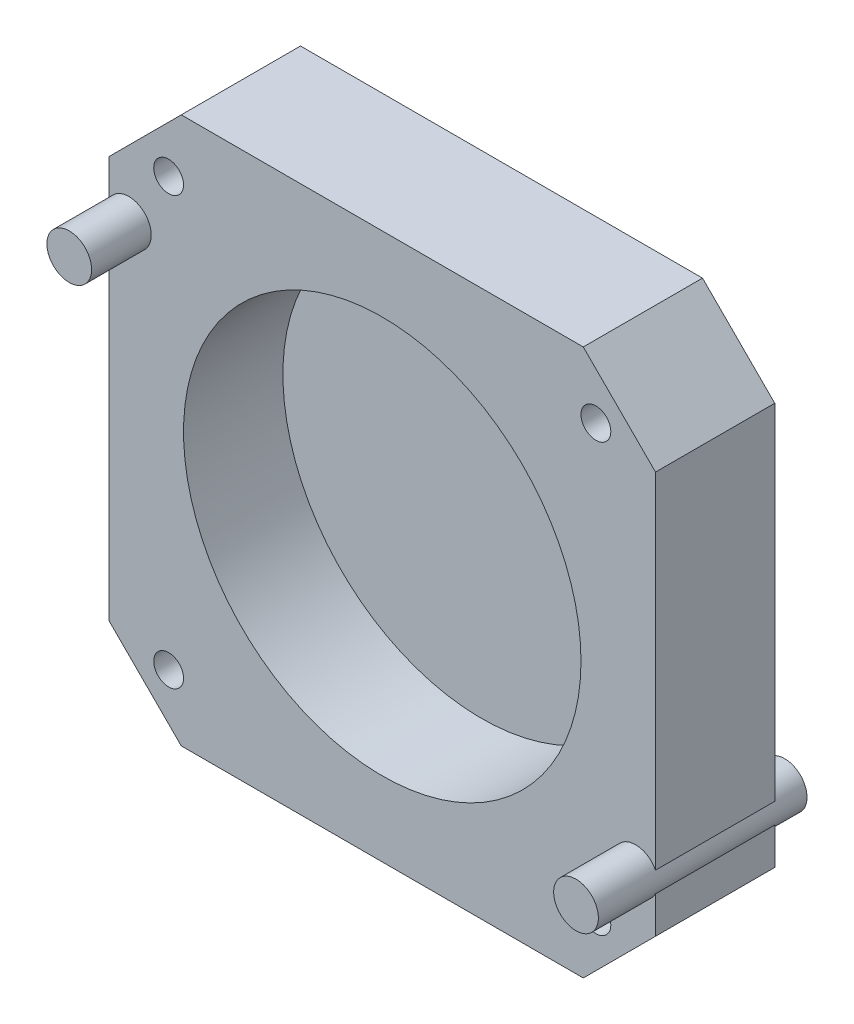
ISO-10303-21;
HEADER;
FILE_DESCRIPTION(('STEP AP214'),'2;1');
FILE_NAME('part.step','',(''),(''),'','','');
FILE_SCHEMA(('AUTOMOTIVE_DESIGN { 1 0 10303 214 1 1 1 1 }'));
ENDSEC;
DATA;
#1=APPLICATION_CONTEXT('core data for automotive mechanical design processes');
#2=APPLICATION_PROTOCOL_DEFINITION('international standard','automotive_design',2000,#1);
#3=PRODUCT_CONTEXT('',#1,'mechanical');
#4=PRODUCT('Part','Part','',(#3));
#5=PRODUCT_RELATED_PRODUCT_CATEGORY('part','',(#4));
#6=PRODUCT_DEFINITION_FORMATION('','',#4);
#7=PRODUCT_DEFINITION_CONTEXT('part definition',#1,'design');
#8=PRODUCT_DEFINITION('design','',#6,#7);
#9=PRODUCT_DEFINITION_SHAPE('','',#8);
#10=(LENGTH_UNIT() NAMED_UNIT(*) SI_UNIT(.MILLI.,.METRE.));
#11=(NAMED_UNIT(*) PLANE_ANGLE_UNIT() SI_UNIT($,.RADIAN.));
#12=(NAMED_UNIT(*) SI_UNIT($,.STERADIAN.) SOLID_ANGLE_UNIT());
#13=UNCERTAINTY_MEASURE_WITH_UNIT(LENGTH_MEASURE(1.E-05),#10,'distance_accuracy_value','');
#14=(GEOMETRIC_REPRESENTATION_CONTEXT(3) GLOBAL_UNCERTAINTY_ASSIGNED_CONTEXT((#13)) GLOBAL_UNIT_ASSIGNED_CONTEXT((#10,
#11,#12)) REPRESENTATION_CONTEXT('',''));
#15=CARTESIAN_POINT('',(0.,0.,0.));
#16=DIRECTION('',(0.,0.,1.));
#17=DIRECTION('',(1.,0.,0.));
#18=AXIS2_PLACEMENT_3D('',#15,#16,#17);
#19=CARTESIAN_POINT('',(0.,0.,0.));
#20=DIRECTION('',(0.,0.,1.));
#21=DIRECTION('',(1.,0.,0.));
#22=AXIS2_PLACEMENT_3D('',#19,#20,#21);
#23=PLANE('',#22);
#24=CARTESIAN_POINT('',(-21.5,21.5,0.));
#25=DIRECTION('',(0.,0.,1.));
#26=DIRECTION('',(1.,0.,0.));
#27=AXIS2_PLACEMENT_3D('',#24,#25,#26);
#28=CIRCLE('',#27,1.5);
#29=CARTESIAN_POINT('',(-20.,21.5,0.));
#30=VERTEX_POINT('',#29);
#31=EDGE_CURVE('E360',#30,#30,#28,.F.);
#32=ORIENTED_EDGE('',*,*,#31,.F.);
#33=EDGE_LOOP('',(#32));
#34=FACE_BOUND('',#33,.T.);
#35=CARTESIAN_POINT('',(-21.5,-21.5,0.));
#36=DIRECTION('',(0.,0.,1.));
#37=DIRECTION('',(1.,0.,0.));
#38=AXIS2_PLACEMENT_3D('',#35,#36,#37);
#39=CIRCLE('',#38,1.5);
#40=CARTESIAN_POINT('',(-20.,-21.5,0.));
#41=VERTEX_POINT('',#40);
#42=EDGE_CURVE('E374',#41,#41,#39,.F.);
#43=ORIENTED_EDGE('',*,*,#42,.F.);
#44=EDGE_LOOP('',(#43));
#45=FACE_BOUND('',#44,.T.);
#46=CARTESIAN_POINT('',(21.5,-21.5,0.));
#47=DIRECTION('',(0.,0.,1.));
#48=DIRECTION('',(1.,0.,0.));
#49=AXIS2_PLACEMENT_3D('',#46,#47,#48);
#50=CIRCLE('',#49,1.5);
#51=CARTESIAN_POINT('',(23.,-21.5,0.));
#52=VERTEX_POINT('',#51);
#53=EDGE_CURVE('E364',#52,#52,#50,.F.);
#54=ORIENTED_EDGE('',*,*,#53,.F.);
#55=EDGE_LOOP('',(#54));
#56=FACE_BOUND('',#55,.T.);
#57=CARTESIAN_POINT('',(21.5,21.5,0.));
#58=DIRECTION('',(0.,0.,1.));
#59=DIRECTION('',(1.,0.,0.));
#60=AXIS2_PLACEMENT_3D('',#57,#58,#59);
#61=CIRCLE('',#60,1.5);
#62=CARTESIAN_POINT('',(23.,21.5,0.));
#63=VERTEX_POINT('',#62);
#64=EDGE_CURVE('E391',#63,#63,#61,.F.);
#65=ORIENTED_EDGE('',*,*,#64,.F.);
#66=EDGE_LOOP('',(#65));
#67=FACE_BOUND('',#66,.T.);
#68=DIRECTION('',(0.,1.,0.));
#69=VECTOR('',#68,1.);
#70=CARTESIAN_POINT('',(27.5,27.5,0.));
#71=LINE('',#70,#69);
#72=CARTESIAN_POINT('',(27.5,-14.4692235935959,0.));
#73=VERTEX_POINT('',#72);
#74=CARTESIAN_POINT('',(27.5,20.2297077300919,0.));
#75=VERTEX_POINT('',#74);
#76=EDGE_CURVE('E395',#73,#75,#71,.T.);
#77=ORIENTED_EDGE('',*,*,#76,.F.);
#78=CARTESIAN_POINT('',(25.4999999999999,-15.5000000000002,0.));
#79=DIRECTION('',(0.,0.,1.));
#80=DIRECTION('',(1.,0.,0.));
#81=AXIS2_PLACEMENT_3D('',#78,#79,#80);
#82=CIRCLE('',#81,2.25);
#83=CARTESIAN_POINT('',(27.5,-16.5307764064045,0.));
#84=VERTEX_POINT('',#83);
#85=EDGE_CURVE('E234',#73,#84,#82,.T.);
#86=ORIENTED_EDGE('',*,*,#85,.T.);
#87=CARTESIAN_POINT('',(27.5,-20.2297077300919,0.));
#88=VERTEX_POINT('',#87);
#89=EDGE_CURVE('E415',#88,#84,#71,.T.);
#90=ORIENTED_EDGE('',*,*,#89,.F.);
#91=DIRECTION('',(0.707106781186547,0.707106781186548,0.));
#92=VECTOR('',#91,1.);
#93=CARTESIAN_POINT('',(20.229707730092,-27.5,0.));
#94=LINE('',#93,#92);
#95=CARTESIAN_POINT('',(20.229707730092,-27.5,0.));
#96=VERTEX_POINT('',#95);
#97=EDGE_CURVE('E306',#96,#88,#94,.T.);
#98=ORIENTED_EDGE('',*,*,#97,.F.);
#99=DIRECTION('',(1.,0.,0.));
#100=VECTOR('',#99,1.);
#101=CARTESIAN_POINT('',(-27.5,-27.5,0.));
#102=LINE('',#101,#100);
#103=CARTESIAN_POINT('',(-20.2297077300919,-27.5,0.));
#104=VERTEX_POINT('',#103);
#105=EDGE_CURVE('E428',#104,#96,#102,.T.);
#106=ORIENTED_EDGE('',*,*,#105,.F.);
#107=DIRECTION('',(0.707106781186548,-0.707106781186548,0.));
#108=VECTOR('',#107,1.);
#109=CARTESIAN_POINT('',(-27.5,-20.2297077300919,0.));
#110=LINE('',#109,#108);
#111=CARTESIAN_POINT('',(-27.5,-20.2297077300919,0.));
#112=VERTEX_POINT('',#111);
#113=EDGE_CURVE('E326',#112,#104,#110,.T.);
#114=ORIENTED_EDGE('',*,*,#113,.F.);
#115=DIRECTION('',(0.,-1.,0.));
#116=VECTOR('',#115,1.);
#117=CARTESIAN_POINT('',(-27.5,27.5,0.));
#118=LINE('',#117,#116);
#119=CARTESIAN_POINT('',(-27.5,14.4692235935956,0.));
#120=VERTEX_POINT('',#119);
#121=EDGE_CURVE('E423',#120,#112,#118,.T.);
#122=ORIENTED_EDGE('',*,*,#121,.F.);
#123=CARTESIAN_POINT('',(-25.5,15.5,0.));
#124=DIRECTION('',(0.,0.,1.));
#125=DIRECTION('',(1.,0.,0.));
#126=AXIS2_PLACEMENT_3D('',#123,#124,#125);
#127=CIRCLE('',#126,2.25);
#128=CARTESIAN_POINT('',(-27.5,16.5307764064044,0.));
#129=VERTEX_POINT('',#128);
#130=EDGE_CURVE('E414',#120,#129,#127,.T.);
#131=ORIENTED_EDGE('',*,*,#130,.T.);
#132=CARTESIAN_POINT('',(-27.5,20.2297077300919,0.));
#133=VERTEX_POINT('',#132);
#134=EDGE_CURVE('E424',#133,#129,#118,.T.);
#135=ORIENTED_EDGE('',*,*,#134,.F.);
#136=DIRECTION('',(-0.707106781186547,-0.707106781186548,0.));
#137=VECTOR('',#136,1.);
#138=CARTESIAN_POINT('',(-27.5,20.2297077300919,0.));
#139=LINE('',#138,#137);
#140=CARTESIAN_POINT('',(-20.229707730092,27.5,0.));
#141=VERTEX_POINT('',#140);
#142=EDGE_CURVE('E317',#141,#133,#139,.T.);
#143=ORIENTED_EDGE('',*,*,#142,.F.);
#144=DIRECTION('',(-1.,0.,0.));
#145=VECTOR('',#144,1.);
#146=CARTESIAN_POINT('',(-27.5,27.5,0.));
#147=LINE('',#146,#145);
#148=CARTESIAN_POINT('',(20.2297077300919,27.5,0.));
#149=VERTEX_POINT('',#148);
#150=EDGE_CURVE('E419',#149,#141,#147,.T.);
#151=ORIENTED_EDGE('',*,*,#150,.F.);
#152=DIRECTION('',(-0.707106781186548,0.707106781186548,0.));
#153=VECTOR('',#152,1.);
#154=CARTESIAN_POINT('',(20.2297077300919,27.5,0.));
#155=LINE('',#154,#153);
#156=EDGE_CURVE('E302',#75,#149,#155,.T.);
#157=ORIENTED_EDGE('',*,*,#156,.F.);
#158=EDGE_LOOP('',(#77,#86,#90,#98,#106,#114,#122,#131,#135,#143,#151,#157));
#159=FACE_BOUND('',#158,.T.);
#160=DIRECTION('',(0.,1.,0.));
#161=VECTOR('',#160,1.);
#162=CARTESIAN_POINT('',(-15.,15.,0.));
#163=LINE('',#162,#161);
#164=CARTESIAN_POINT('',(-15.,-15.,0.));
#165=VERTEX_POINT('',#164);
#166=CARTESIAN_POINT('',(-15.,15.,0.));
#167=VERTEX_POINT('',#166);
#168=EDGE_CURVE('E206',#165,#167,#163,.T.);
#169=ORIENTED_EDGE('',*,*,#168,.F.);
#170=DIRECTION('',(-1.,0.,0.));
#171=VECTOR('',#170,1.);
#172=CARTESIAN_POINT('',(15.,-15.,0.));
#173=LINE('',#172,#171);
#174=CARTESIAN_POINT('',(15.,-15.,0.));
#175=VERTEX_POINT('',#174);
#176=EDGE_CURVE('E203',#175,#165,#173,.T.);
#177=ORIENTED_EDGE('',*,*,#176,.F.);
#178=DIRECTION('',(0.,-1.,0.));
#179=VECTOR('',#178,1.);
#180=CARTESIAN_POINT('',(15.,15.,0.));
#181=LINE('',#180,#179);
#182=CARTESIAN_POINT('',(15.,15.,0.));
#183=VERTEX_POINT('',#182);
#184=EDGE_CURVE('E66',#183,#175,#181,.T.);
#185=ORIENTED_EDGE('',*,*,#184,.F.);
#186=DIRECTION('',(1.,0.,0.));
#187=VECTOR('',#186,1.);
#188=CARTESIAN_POINT('',(15.,15.,0.));
#189=LINE('',#188,#187);
#190=EDGE_CURVE('E61',#167,#183,#189,.T.);
#191=ORIENTED_EDGE('',*,*,#190,.F.);
#192=EDGE_LOOP('',(#169,#177,#185,#191));
#193=FACE_BOUND('',#192,.T.);
#194=ADVANCED_FACE('F45',(#34,#45,#56,#67,#159,#193),#23,.F.);
#195=CARTESIAN_POINT('',(27.5,27.5,12.));
#196=DIRECTION('',(-1.,0.,0.));
#197=DIRECTION('',(0.,0.,1.));
#198=AXIS2_PLACEMENT_3D('',#195,#196,#197);
#199=PLANE('',#198);
#200=ORIENTED_EDGE('',*,*,#89,.T.);
#201=DIRECTION('',(0.,0.,1.));
#202=VECTOR('',#201,1.);
#203=CARTESIAN_POINT('',(27.5,-16.5307764064045,-3.));
#204=LINE('',#203,#202);
#205=CARTESIAN_POINT('',(27.5,-16.5307764064045,12.));
#206=VERTEX_POINT('',#205);
#207=EDGE_CURVE('E275',#84,#206,#204,.T.);
#208=ORIENTED_EDGE('',*,*,#207,.T.);
#209=DIRECTION('',(0.,1.,0.));
#210=VECTOR('',#209,1.);
#211=CARTESIAN_POINT('',(27.5,27.5,12.));
#212=LINE('',#211,#210);
#213=CARTESIAN_POINT('',(27.5,-20.2297077300919,12.));
#214=VERTEX_POINT('',#213);
#215=EDGE_CURVE('E396',#214,#206,#212,.T.);
#216=ORIENTED_EDGE('',*,*,#215,.F.);
#217=DIRECTION('',(0.,0.,1.));
#218=VECTOR('',#217,1.);
#219=CARTESIAN_POINT('',(27.5,-20.2297077300919,-0.000999999999999265));
#220=LINE('',#219,#218);
#221=EDGE_CURVE('E318',#88,#214,#220,.T.);
#222=ORIENTED_EDGE('',*,*,#221,.F.);
#223=EDGE_LOOP('',(#200,#208,#216,#222));
#224=FACE_BOUND('',#223,.T.);
#225=ADVANCED_FACE('F444',(#224),#199,.F.);
#226=CARTESIAN_POINT('',(-27.5,27.5,12.));
#227=DIRECTION('',(1.,0.,0.));
#228=DIRECTION('',(0.,0.,-1.));
#229=AXIS2_PLACEMENT_3D('',#226,#227,#228);
#230=PLANE('',#229);
#231=ORIENTED_EDGE('',*,*,#134,.T.);
#232=DIRECTION('',(0.,0.,1.));
#233=VECTOR('',#232,1.);
#234=CARTESIAN_POINT('',(-27.5,16.5307764064044,-3.));
#235=LINE('',#234,#233);
#236=CARTESIAN_POINT('',(-27.5,16.5307764064044,12.));
#237=VERTEX_POINT('',#236);
#238=EDGE_CURVE('E294',#129,#237,#235,.T.);
#239=ORIENTED_EDGE('',*,*,#238,.T.);
#240=DIRECTION('',(0.,-1.,0.));
#241=VECTOR('',#240,1.);
#242=CARTESIAN_POINT('',(-27.5,27.5,12.));
#243=LINE('',#242,#241);
#244=CARTESIAN_POINT('',(-27.5,20.2297077300919,12.));
#245=VERTEX_POINT('',#244);
#246=EDGE_CURVE('E406',#245,#237,#243,.T.);
#247=ORIENTED_EDGE('',*,*,#246,.F.);
#248=DIRECTION('',(0.,0.,1.));
#249=VECTOR('',#248,1.);
#250=CARTESIAN_POINT('',(-27.5,20.2297077300919,-0.000999999999999265));
#251=LINE('',#250,#249);
#252=EDGE_CURVE('E348',#133,#245,#251,.T.);
#253=ORIENTED_EDGE('',*,*,#252,.F.);
#254=EDGE_LOOP('',(#231,#239,#247,#253));
#255=FACE_BOUND('',#254,.T.);
#256=ADVANCED_FACE('F491',(#255),#230,.F.);
#257=CARTESIAN_POINT('',(27.5,-14.4692235935959,12.));
#258=VERTEX_POINT('',#257);
#259=CARTESIAN_POINT('',(27.5,20.2297077300919,12.));
#260=VERTEX_POINT('',#259);
#261=EDGE_CURVE('E401',#258,#260,#212,.T.);
#262=ORIENTED_EDGE('',*,*,#261,.F.);
#263=DIRECTION('',(0.,0.,1.));
#264=VECTOR('',#263,1.);
#265=CARTESIAN_POINT('',(27.5,-14.4692235935959,-3.));
#266=LINE('',#265,#264);
#267=EDGE_CURVE('E271',#258,#73,#266,.F.);
#268=ORIENTED_EDGE('',*,*,#267,.T.);
#269=ORIENTED_EDGE('',*,*,#76,.T.);
#270=DIRECTION('',(0.,0.,1.));
#271=VECTOR('',#270,1.);
#272=CARTESIAN_POINT('',(27.5,20.2297077300919,-0.000999999999999265));
#273=LINE('',#272,#271);
#274=EDGE_CURVE('E305',#75,#260,#273,.T.);
#275=ORIENTED_EDGE('',*,*,#274,.T.);
#276=EDGE_LOOP('',(#262,#268,#269,#275));
#277=FACE_BOUND('',#276,.T.);
#278=ADVANCED_FACE('F47',(#277),#199,.F.);
#279=CARTESIAN_POINT('',(-27.5,27.5,12.));
#280=DIRECTION('',(0.,-1.,0.));
#281=DIRECTION('',(0.,0.,-1.));
#282=AXIS2_PLACEMENT_3D('',#279,#280,#281);
#283=PLANE('',#282);
#284=DIRECTION('',(-1.,0.,0.));
#285=VECTOR('',#284,1.);
#286=CARTESIAN_POINT('',(-27.5,27.5,12.));
#287=LINE('',#286,#285);
#288=CARTESIAN_POINT('',(20.2297077300919,27.5,12.));
#289=VERTEX_POINT('',#288);
#290=CARTESIAN_POINT('',(-20.229707730092,27.5,12.));
#291=VERTEX_POINT('',#290);
#292=EDGE_CURVE('E400',#289,#291,#287,.T.);
#293=ORIENTED_EDGE('',*,*,#292,.F.);
#294=DIRECTION('',(0.,0.,1.));
#295=VECTOR('',#294,1.);
#296=CARTESIAN_POINT('',(20.2297077300919,27.5,-0.000999999999999265));
#297=LINE('',#296,#295);
#298=EDGE_CURVE('E307',#149,#289,#297,.T.);
#299=ORIENTED_EDGE('',*,*,#298,.F.);
#300=ORIENTED_EDGE('',*,*,#150,.T.);
#301=DIRECTION('',(0.,0.,1.));
#302=VECTOR('',#301,1.);
#303=CARTESIAN_POINT('',(-20.229707730092,27.5,-0.000999999999999265));
#304=LINE('',#303,#302);
#305=EDGE_CURVE('E349',#141,#291,#304,.T.);
#306=ORIENTED_EDGE('',*,*,#305,.T.);
#307=EDGE_LOOP('',(#293,#299,#300,#306));
#308=FACE_BOUND('',#307,.T.);
#309=ADVANCED_FACE('F481',(#308),#283,.F.);
#310=CARTESIAN_POINT('',(-27.5,14.4692235935956,12.));
#311=VERTEX_POINT('',#310);
#312=CARTESIAN_POINT('',(-27.5,-20.2297077300919,12.));
#313=VERTEX_POINT('',#312);
#314=EDGE_CURVE('E405',#311,#313,#243,.T.);
#315=ORIENTED_EDGE('',*,*,#314,.F.);
#316=DIRECTION('',(0.,0.,1.));
#317=VECTOR('',#316,1.);
#318=CARTESIAN_POINT('',(-27.5,14.4692235935956,-3.));
#319=LINE('',#318,#317);
#320=EDGE_CURVE('E290',#311,#120,#319,.F.);
#321=ORIENTED_EDGE('',*,*,#320,.T.);
#322=ORIENTED_EDGE('',*,*,#121,.T.);
#323=DIRECTION('',(0.,0.,1.));
#324=VECTOR('',#323,1.);
#325=CARTESIAN_POINT('',(-27.5,-20.2297077300919,-0.000999999999999265));
#326=LINE('',#325,#324);
#327=EDGE_CURVE('E331',#112,#313,#326,.T.);
#328=ORIENTED_EDGE('',*,*,#327,.T.);
#329=EDGE_LOOP('',(#315,#321,#322,#328));
#330=FACE_BOUND('',#329,.T.);
#331=ADVANCED_FACE('F466',(#330),#230,.F.);
#332=CARTESIAN_POINT('',(-27.5,-27.5,12.));
#333=DIRECTION('',(0.,1.,0.));
#334=DIRECTION('',(0.,0.,1.));
#335=AXIS2_PLACEMENT_3D('',#332,#333,#334);
#336=PLANE('',#335);
#337=DIRECTION('',(1.,0.,0.));
#338=VECTOR('',#337,1.);
#339=CARTESIAN_POINT('',(-27.5,-27.5,12.));
#340=LINE('',#339,#338);
#341=CARTESIAN_POINT('',(-20.2297077300919,-27.5,12.));
#342=VERTEX_POINT('',#341);
#343=CARTESIAN_POINT('',(20.229707730092,-27.5,12.));
#344=VERTEX_POINT('',#343);
#345=EDGE_CURVE('E410',#342,#344,#340,.T.);
#346=ORIENTED_EDGE('',*,*,#345,.F.);
#347=DIRECTION('',(0.,0.,1.));
#348=VECTOR('',#347,1.);
#349=CARTESIAN_POINT('',(-20.2297077300919,-27.5,-0.000999999999999265));
#350=LINE('',#349,#348);
#351=EDGE_CURVE('E301',#104,#342,#350,.T.);
#352=ORIENTED_EDGE('',*,*,#351,.F.);
#353=ORIENTED_EDGE('',*,*,#105,.T.);
#354=DIRECTION('',(0.,0.,1.));
#355=VECTOR('',#354,1.);
#356=CARTESIAN_POINT('',(20.229707730092,-27.5,-0.000999999999999265));
#357=LINE('',#356,#355);
#358=EDGE_CURVE('E322',#96,#344,#357,.T.);
#359=ORIENTED_EDGE('',*,*,#358,.T.);
#360=EDGE_LOOP('',(#346,#352,#353,#359));
#361=FACE_BOUND('',#360,.T.);
#362=ADVANCED_FACE('F457',(#361),#336,.F.);
#363=CARTESIAN_POINT('',(0.,0.,12.));
#364=DIRECTION('',(0.,0.,1.));
#365=DIRECTION('',(1.,0.,0.));
#366=AXIS2_PLACEMENT_3D('',#363,#364,#365);
#367=PLANE('',#366);
#368=CARTESIAN_POINT('',(25.4999999999999,-15.5000000000002,12.));
#369=DIRECTION('',(0.,0.,1.));
#370=DIRECTION('',(1.,0.,0.));
#371=AXIS2_PLACEMENT_3D('',#368,#369,#370);
#372=CIRCLE('',#371,2.25);
#373=EDGE_CURVE('E279',#258,#206,#372,.T.);
#374=ORIENTED_EDGE('',*,*,#373,.F.);
#375=ORIENTED_EDGE('',*,*,#261,.T.);
#376=DIRECTION('',(0.707106781186548,-0.707106781186548,0.));
#377=VECTOR('',#376,1.);
#378=CARTESIAN_POINT('',(20.2297077300919,27.5,12.));
#379=LINE('',#378,#377);
#380=EDGE_CURVE('E310',#289,#260,#379,.T.);
#381=ORIENTED_EDGE('',*,*,#380,.F.);
#382=ORIENTED_EDGE('',*,*,#292,.T.);
#383=DIRECTION('',(0.707106781186547,0.707106781186548,0.));
#384=VECTOR('',#383,1.);
#385=CARTESIAN_POINT('',(-27.5,20.2297077300919,12.));
#386=LINE('',#385,#384);
#387=EDGE_CURVE('E345',#245,#291,#386,.T.);
#388=ORIENTED_EDGE('',*,*,#387,.F.);
#389=ORIENTED_EDGE('',*,*,#246,.T.);
#390=CARTESIAN_POINT('',(-25.5,15.5,12.));
#391=DIRECTION('',(0.,0.,1.));
#392=DIRECTION('',(1.,0.,0.));
#393=AXIS2_PLACEMENT_3D('',#390,#391,#392);
#394=CIRCLE('',#393,2.25);
#395=EDGE_CURVE('E298',#311,#237,#394,.T.);
#396=ORIENTED_EDGE('',*,*,#395,.F.);
#397=ORIENTED_EDGE('',*,*,#314,.T.);
#398=DIRECTION('',(-0.707106781186548,0.707106781186548,0.));
#399=VECTOR('',#398,1.);
#400=CARTESIAN_POINT('',(-27.5,-20.2297077300919,12.));
#401=LINE('',#400,#399);
#402=EDGE_CURVE('E335',#342,#313,#401,.T.);
#403=ORIENTED_EDGE('',*,*,#402,.F.);
#404=ORIENTED_EDGE('',*,*,#345,.T.);
#405=DIRECTION('',(-0.707106781186547,-0.707106781186548,0.));
#406=VECTOR('',#405,1.);
#407=CARTESIAN_POINT('',(20.229707730092,-27.5,12.));
#408=LINE('',#407,#406);
#409=EDGE_CURVE('E321',#214,#344,#408,.T.);
#410=ORIENTED_EDGE('',*,*,#409,.F.);
#411=ORIENTED_EDGE('',*,*,#215,.T.);
#412=EDGE_LOOP('',(#374,#375,#381,#382,#388,#389,#396,#397,#403,#404,#410,#411));
#413=FACE_BOUND('',#412,.T.);
#414=CARTESIAN_POINT('',(0.,0.,12.));
#415=DIRECTION('',(0.,0.,1.));
#416=DIRECTION('',(1.,0.,0.));
#417=AXIS2_PLACEMENT_3D('',#414,#415,#416);
#418=CIRCLE('',#417,20.);
#419=CARTESIAN_POINT('',(20.,0.,12.));
#420=VERTEX_POINT('',#419);
#421=EDGE_CURVE('E353',#420,#420,#418,.T.);
#422=ORIENTED_EDGE('',*,*,#421,.F.);
#423=EDGE_LOOP('',(#422));
#424=FACE_BOUND('',#423,.T.);
#425=CARTESIAN_POINT('',(-21.5,21.5,12.));
#426=DIRECTION('',(0.,0.,1.));
#427=DIRECTION('',(-1.,0.,0.));
#428=AXIS2_PLACEMENT_3D('',#425,#426,#427);
#429=CIRCLE('',#428,1.5);
#430=CARTESIAN_POINT('',(-23.,21.5,12.));
#431=VERTEX_POINT('',#430);
#432=EDGE_CURVE('E378',#431,#431,#429,.T.);
#433=ORIENTED_EDGE('',*,*,#432,.F.);
#434=EDGE_LOOP('',(#433));
#435=FACE_BOUND('',#434,.T.);
#436=CARTESIAN_POINT('',(-21.5,-21.5,12.));
#437=DIRECTION('',(0.,0.,1.));
#438=DIRECTION('',(1.,0.,0.));
#439=AXIS2_PLACEMENT_3D('',#436,#437,#438);
#440=CIRCLE('',#439,1.5);
#441=CARTESIAN_POINT('',(-20.,-21.5,12.));
#442=VERTEX_POINT('',#441);
#443=EDGE_CURVE('E369',#442,#442,#440,.T.);
#444=ORIENTED_EDGE('',*,*,#443,.F.);
#445=EDGE_LOOP('',(#444));
#446=FACE_BOUND('',#445,.T.);
#447=CARTESIAN_POINT('',(21.5,-21.5,12.));
#448=DIRECTION('',(0.,0.,1.));
#449=DIRECTION('',(-1.,0.,0.));
#450=AXIS2_PLACEMENT_3D('',#447,#448,#449);
#451=CIRCLE('',#450,1.5);
#452=CARTESIAN_POINT('',(20.,-21.5,12.));
#453=VERTEX_POINT('',#452);
#454=EDGE_CURVE('E368',#453,#453,#451,.T.);
#455=ORIENTED_EDGE('',*,*,#454,.F.);
#456=EDGE_LOOP('',(#455));
#457=FACE_BOUND('',#456,.T.);
#458=CARTESIAN_POINT('',(21.5,21.5,12.));
#459=DIRECTION('',(0.,0.,1.));
#460=DIRECTION('',(1.,0.,0.));
#461=AXIS2_PLACEMENT_3D('',#458,#459,#460);
#462=CIRCLE('',#461,1.5);
#463=CARTESIAN_POINT('',(23.,21.5,12.));
#464=VERTEX_POINT('',#463);
#465=EDGE_CURVE('E373',#464,#464,#462,.T.);
#466=ORIENTED_EDGE('',*,*,#465,.F.);
#467=EDGE_LOOP('',(#466));
#468=FACE_BOUND('',#467,.T.);
#469=ADVANCED_FACE('F451',(#413,#424,#435,#446,#457,#468),#367,.T.);
#470=CARTESIAN_POINT('',(21.5,21.5,-0.000999999999999265));
#471=DIRECTION('',(0.,0.,1.));
#472=DIRECTION('',(1.,0.,0.));
#473=AXIS2_PLACEMENT_3D('',#470,#471,#472);
#474=CYLINDRICAL_SURFACE('',#473,1.5);
#475=ORIENTED_EDGE('',*,*,#465,.T.);
#476=EDGE_LOOP('',(#475));
#477=FACE_BOUND('',#476,.T.);
#478=ORIENTED_EDGE('',*,*,#64,.T.);
#479=EDGE_LOOP('',(#478));
#480=FACE_BOUND('',#479,.T.);
#481=ADVANCED_FACE('F604',(#477,#480),#474,.F.);
#482=CARTESIAN_POINT('',(21.5,-21.5,-0.000999999999999265));
#483=DIRECTION('',(0.,0.,1.));
#484=DIRECTION('',(1.,0.,0.));
#485=AXIS2_PLACEMENT_3D('',#482,#483,#484);
#486=CYLINDRICAL_SURFACE('',#485,1.5);
#487=ORIENTED_EDGE('',*,*,#454,.T.);
#488=EDGE_LOOP('',(#487));
#489=FACE_BOUND('',#488,.T.);
#490=ORIENTED_EDGE('',*,*,#53,.T.);
#491=EDGE_LOOP('',(#490));
#492=FACE_BOUND('',#491,.T.);
#493=ADVANCED_FACE('F594',(#489,#492),#486,.F.);
#494=CARTESIAN_POINT('',(-21.5,-21.5,-0.000999999999999265));
#495=DIRECTION('',(0.,0.,1.));
#496=DIRECTION('',(1.,0.,0.));
#497=AXIS2_PLACEMENT_3D('',#494,#495,#496);
#498=CYLINDRICAL_SURFACE('',#497,1.5);
#499=ORIENTED_EDGE('',*,*,#443,.T.);
#500=EDGE_LOOP('',(#499));
#501=FACE_BOUND('',#500,.T.);
#502=ORIENTED_EDGE('',*,*,#42,.T.);
#503=EDGE_LOOP('',(#502));
#504=FACE_BOUND('',#503,.T.);
#505=ADVANCED_FACE('F584',(#501,#504),#498,.F.);
#506=CARTESIAN_POINT('',(-21.5,21.5,-0.000999999999999265));
#507=DIRECTION('',(0.,0.,1.));
#508=DIRECTION('',(1.,0.,0.));
#509=AXIS2_PLACEMENT_3D('',#506,#507,#508);
#510=CYLINDRICAL_SURFACE('',#509,1.5);
#511=ORIENTED_EDGE('',*,*,#432,.T.);
#512=EDGE_LOOP('',(#511));
#513=FACE_BOUND('',#512,.T.);
#514=ORIENTED_EDGE('',*,*,#31,.T.);
#515=EDGE_LOOP('',(#514));
#516=FACE_BOUND('',#515,.T.);
#517=ADVANCED_FACE('F574',(#513,#516),#510,.F.);
#518=CARTESIAN_POINT('',(0.,0.,2.));
#519=DIRECTION('',(0.,0.,1.));
#520=DIRECTION('',(1.,0.,0.));
#521=AXIS2_PLACEMENT_3D('',#518,#519,#520);
#522=CYLINDRICAL_SURFACE('',#521,20.);
#523=CARTESIAN_POINT('',(0.,0.,2.));
#524=DIRECTION('',(0.,0.,1.));
#525=DIRECTION('',(1.,0.,0.));
#526=AXIS2_PLACEMENT_3D('',#523,#524,#525);
#527=CIRCLE('',#526,20.);
#528=CARTESIAN_POINT('',(20.,0.,2.));
#529=VERTEX_POINT('',#528);
#530=EDGE_CURVE('E356',#529,#529,#527,.T.);
#531=ORIENTED_EDGE('',*,*,#530,.F.);
#532=EDGE_LOOP('',(#531));
#533=FACE_BOUND('',#532,.T.);
#534=ORIENTED_EDGE('',*,*,#421,.T.);
#535=EDGE_LOOP('',(#534));
#536=FACE_BOUND('',#535,.T.);
#537=ADVANCED_FACE('F504',(#533,#536),#522,.F.);
#538=CARTESIAN_POINT('',(0.,0.,2.));
#539=DIRECTION('',(0.,0.,1.));
#540=DIRECTION('',(1.,0.,0.));
#541=AXIS2_PLACEMENT_3D('',#538,#539,#540);
#542=PLANE('',#541);
#543=ORIENTED_EDGE('',*,*,#530,.T.);
#544=EDGE_LOOP('',(#543));
#545=FACE_BOUND('',#544,.T.);
#546=ADVANCED_FACE('F496',(#545),#542,.T.);
#547=CARTESIAN_POINT('',(-27.5,20.2297077300919,-0.000999999999999265));
#548=DIRECTION('',(0.707106781186548,-0.707106781186547,0.));
#549=DIRECTION('',(0.707106781186547,0.707106781186548,0.));
#550=AXIS2_PLACEMENT_3D('',#547,#548,#549);
#551=PLANE('',#550);
#552=ORIENTED_EDGE('',*,*,#142,.T.);
#553=ORIENTED_EDGE('',*,*,#252,.T.);
#554=ORIENTED_EDGE('',*,*,#387,.T.);
#555=ORIENTED_EDGE('',*,*,#305,.F.);
#556=EDGE_LOOP('',(#552,#553,#554,#555));
#557=FACE_BOUND('',#556,.T.);
#558=ADVANCED_FACE('F494',(#557),#551,.F.);
#559=CARTESIAN_POINT('',(20.2297077300919,27.5,-0.000999999999999265));
#560=DIRECTION('',(-0.707106781186548,-0.707106781186548,0.));
#561=DIRECTION('',(0.707106781186548,-0.707106781186548,0.));
#562=AXIS2_PLACEMENT_3D('',#559,#560,#561);
#563=PLANE('',#562);
#564=ORIENTED_EDGE('',*,*,#156,.T.);
#565=ORIENTED_EDGE('',*,*,#298,.T.);
#566=ORIENTED_EDGE('',*,*,#380,.T.);
#567=ORIENTED_EDGE('',*,*,#274,.F.);
#568=EDGE_LOOP('',(#564,#565,#566,#567));
#569=FACE_BOUND('',#568,.T.);
#570=ADVANCED_FACE('F473',(#569),#563,.F.);
#571=CARTESIAN_POINT('',(20.229707730092,-27.5,-0.000999999999999265));
#572=DIRECTION('',(-0.707106781186548,0.707106781186547,0.));
#573=DIRECTION('',(-0.707106781186547,-0.707106781186548,0.));
#574=AXIS2_PLACEMENT_3D('',#571,#572,#573);
#575=PLANE('',#574);
#576=ORIENTED_EDGE('',*,*,#97,.T.);
#577=ORIENTED_EDGE('',*,*,#221,.T.);
#578=ORIENTED_EDGE('',*,*,#409,.T.);
#579=ORIENTED_EDGE('',*,*,#358,.F.);
#580=EDGE_LOOP('',(#576,#577,#578,#579));
#581=FACE_BOUND('',#580,.T.);
#582=ADVANCED_FACE('F448',(#581),#575,.F.);
#583=CARTESIAN_POINT('',(-27.5,-20.2297077300919,-0.000999999999999265));
#584=DIRECTION('',(0.707106781186548,0.707106781186548,0.));
#585=DIRECTION('',(-0.707106781186548,0.707106781186548,0.));
#586=AXIS2_PLACEMENT_3D('',#583,#584,#585);
#587=PLANE('',#586);
#588=ORIENTED_EDGE('',*,*,#113,.T.);
#589=ORIENTED_EDGE('',*,*,#351,.T.);
#590=ORIENTED_EDGE('',*,*,#402,.T.);
#591=ORIENTED_EDGE('',*,*,#327,.F.);
#592=EDGE_LOOP('',(#588,#589,#590,#591));
#593=FACE_BOUND('',#592,.T.);
#594=ADVANCED_FACE('F463',(#593),#587,.F.);
#595=CARTESIAN_POINT('',(-25.5,15.5,-3.));
#596=DIRECTION('',(0.,0.,1.));
#597=DIRECTION('',(1.,0.,0.));
#598=AXIS2_PLACEMENT_3D('',#595,#596,#597);
#599=CYLINDRICAL_SURFACE('',#598,2.25);
#600=ORIENTED_EDGE('',*,*,#320,.F.);
#601=ORIENTED_EDGE('',*,*,#395,.T.);
#602=ORIENTED_EDGE('',*,*,#238,.F.);
#603=ORIENTED_EDGE('',*,*,#130,.F.);
#604=EDGE_LOOP('',(#600,#601,#602,#603));
#605=FACE_BOUND('',#604,.T.);
#606=CARTESIAN_POINT('',(-25.5,15.5,-3.));
#607=DIRECTION('',(0.,0.,1.));
#608=DIRECTION('',(1.,0.,0.));
#609=AXIS2_PLACEMENT_3D('',#606,#607,#608);
#610=CIRCLE('',#609,2.25);
#611=CARTESIAN_POINT('',(-23.25,15.5,-3.));
#612=VERTEX_POINT('',#611);
#613=EDGE_CURVE('E286',#612,#612,#610,.T.);
#614=ORIENTED_EDGE('',*,*,#613,.T.);
#615=EDGE_LOOP('',(#614));
#616=FACE_BOUND('',#615,.T.);
#617=CARTESIAN_POINT('',(-25.5,15.5,18.));
#618=DIRECTION('',(0.,0.,1.));
#619=DIRECTION('',(1.,0.,0.));
#620=AXIS2_PLACEMENT_3D('',#617,#618,#619);
#621=CIRCLE('',#620,2.25);
#622=CARTESIAN_POINT('',(-23.25,15.5,18.));
#623=VERTEX_POINT('',#622);
#624=EDGE_CURVE('E282',#623,#623,#621,.T.);
#625=ORIENTED_EDGE('',*,*,#624,.F.);
#626=EDGE_LOOP('',(#625));
#627=FACE_BOUND('',#626,.T.);
#628=ADVANCED_FACE('F488',(#605,#616,#627),#599,.T.);
#629=CARTESIAN_POINT('',(-25.5,15.5,-3.));
#630=DIRECTION('',(0.,0.,1.));
#631=DIRECTION('',(1.,0.,0.));
#632=AXIS2_PLACEMENT_3D('',#629,#630,#631);
#633=PLANE('',#632);
#634=ORIENTED_EDGE('',*,*,#613,.F.);
#635=EDGE_LOOP('',(#634));
#636=FACE_BOUND('',#635,.T.);
#637=ADVANCED_FACE('F647',(#636),#633,.F.);
#638=CARTESIAN_POINT('',(-25.5,15.5,18.));
#639=DIRECTION('',(0.,0.,1.));
#640=DIRECTION('',(1.,0.,0.));
#641=AXIS2_PLACEMENT_3D('',#638,#639,#640);
#642=PLANE('',#641);
#643=ORIENTED_EDGE('',*,*,#624,.T.);
#644=EDGE_LOOP('',(#643));
#645=FACE_BOUND('',#644,.T.);
#646=ADVANCED_FACE('F654',(#645),#642,.T.);
#647=CARTESIAN_POINT('',(25.4999999999999,-15.5000000000002,-3.));
#648=DIRECTION('',(0.,0.,1.));
#649=DIRECTION('',(1.,0.,0.));
#650=AXIS2_PLACEMENT_3D('',#647,#648,#649);
#651=CYLINDRICAL_SURFACE('',#650,2.25);
#652=ORIENTED_EDGE('',*,*,#267,.F.);
#653=ORIENTED_EDGE('',*,*,#373,.T.);
#654=ORIENTED_EDGE('',*,*,#207,.F.);
#655=ORIENTED_EDGE('',*,*,#85,.F.);
#656=EDGE_LOOP('',(#652,#653,#654,#655));
#657=FACE_BOUND('',#656,.T.);
#658=CARTESIAN_POINT('',(25.4999999999999,-15.5000000000002,-3.));
#659=DIRECTION('',(0.,0.,1.));
#660=DIRECTION('',(1.,0.,0.));
#661=AXIS2_PLACEMENT_3D('',#658,#659,#660);
#662=CIRCLE('',#661,2.25);
#663=CARTESIAN_POINT('',(27.7499999999999,-15.5000000000002,-3.));
#664=VERTEX_POINT('',#663);
#665=EDGE_CURVE('E263',#664,#664,#662,.T.);
#666=ORIENTED_EDGE('',*,*,#665,.T.);
#667=EDGE_LOOP('',(#666));
#668=FACE_BOUND('',#667,.T.);
#669=CARTESIAN_POINT('',(25.4999999999999,-15.5000000000002,18.));
#670=DIRECTION('',(0.,0.,1.));
#671=DIRECTION('',(1.,0.,0.));
#672=AXIS2_PLACEMENT_3D('',#669,#670,#671);
#673=CIRCLE('',#672,2.25);
#674=CARTESIAN_POINT('',(27.7499999999999,-15.5000000000002,18.));
#675=VERTEX_POINT('',#674);
#676=EDGE_CURVE('E267',#675,#675,#673,.T.);
#677=ORIENTED_EDGE('',*,*,#676,.F.);
#678=EDGE_LOOP('',(#677));
#679=FACE_BOUND('',#678,.T.);
#680=ADVANCED_FACE('F663',(#657,#668,#679),#651,.T.);
#681=CARTESIAN_POINT('',(25.4999999999999,-15.5000000000002,-3.));
#682=DIRECTION('',(0.,0.,1.));
#683=DIRECTION('',(1.,0.,0.));
#684=AXIS2_PLACEMENT_3D('',#681,#682,#683);
#685=PLANE('',#684);
#686=ORIENTED_EDGE('',*,*,#665,.F.);
#687=EDGE_LOOP('',(#686));
#688=FACE_BOUND('',#687,.T.);
#689=ADVANCED_FACE('F672',(#688),#685,.F.);
#690=CARTESIAN_POINT('',(25.4999999999999,-15.5000000000002,18.));
#691=DIRECTION('',(0.,0.,1.));
#692=DIRECTION('',(1.,0.,0.));
#693=AXIS2_PLACEMENT_3D('',#690,#691,#692);
#694=PLANE('',#693);
#695=ORIENTED_EDGE('',*,*,#676,.T.);
#696=EDGE_LOOP('',(#695));
#697=FACE_BOUND('',#696,.T.);
#698=ADVANCED_FACE('F680',(#697),#694,.T.);
#699=CARTESIAN_POINT('',(0.,0.,-0.1));
#700=DIRECTION('',(0.,0.,-1.));
#701=DIRECTION('',(-1.,0.,0.));
#702=AXIS2_PLACEMENT_3D('',#699,#700,#701);
#703=PLANE('',#702);
#704=DIRECTION('',(0.,1.,0.));
#705=VECTOR('',#704,1.);
#706=CARTESIAN_POINT('',(-15.,15.,-0.1));
#707=LINE('',#706,#705);
#708=CARTESIAN_POINT('',(-15.,-15.,-0.1));
#709=VERTEX_POINT('',#708);
#710=CARTESIAN_POINT('',(-15.,15.,-0.1));
#711=VERTEX_POINT('',#710);
#712=EDGE_CURVE('E192',#709,#711,#707,.T.);
#713=ORIENTED_EDGE('',*,*,#712,.T.);
#714=DIRECTION('',(1.,0.,0.));
#715=VECTOR('',#714,1.);
#716=CARTESIAN_POINT('',(15.,15.,-0.1));
#717=LINE('',#716,#715);
#718=CARTESIAN_POINT('',(15.,15.,-0.1));
#719=VERTEX_POINT('',#718);
#720=EDGE_CURVE('E180',#711,#719,#717,.T.);
#721=ORIENTED_EDGE('',*,*,#720,.T.);
#722=DIRECTION('',(0.,-1.,0.));
#723=VECTOR('',#722,1.);
#724=CARTESIAN_POINT('',(15.,15.,-0.1));
#725=LINE('',#724,#723);
#726=CARTESIAN_POINT('',(15.,-15.,-0.1));
#727=VERTEX_POINT('',#726);
#728=EDGE_CURVE('E191',#719,#727,#725,.T.);
#729=ORIENTED_EDGE('',*,*,#728,.T.);
#730=DIRECTION('',(-1.,0.,0.));
#731=VECTOR('',#730,1.);
#732=CARTESIAN_POINT('',(15.,-15.,-0.1));
#733=LINE('',#732,#731);
#734=EDGE_CURVE('E198',#727,#709,#733,.T.);
#735=ORIENTED_EDGE('',*,*,#734,.T.);
#736=EDGE_LOOP('',(#713,#721,#729,#735));
#737=FACE_BOUND('',#736,.T.);
#738=DIRECTION('',(0.,1.,0.));
#739=VECTOR('',#738,1.);
#740=CARTESIAN_POINT('',(-7.,7.,-0.1));
#741=LINE('',#740,#739);
#742=CARTESIAN_POINT('',(-7.,-7.,-0.1));
#743=VERTEX_POINT('',#742);
#744=CARTESIAN_POINT('',(-7.,7.,-0.1));
#745=VERTEX_POINT('',#744);
#746=EDGE_CURVE('E222',#743,#745,#741,.T.);
#747=ORIENTED_EDGE('',*,*,#746,.F.);
#748=DIRECTION('',(-1.,0.,0.));
#749=VECTOR('',#748,1.);
#750=CARTESIAN_POINT('',(7.,-7.,-0.1));
#751=LINE('',#750,#749);
#752=CARTESIAN_POINT('',(7.,-7.,-0.1));
#753=VERTEX_POINT('',#752);
#754=EDGE_CURVE('E11',#753,#743,#751,.T.);
#755=ORIENTED_EDGE('',*,*,#754,.F.);
#756=DIRECTION('',(0.,-1.,0.));
#757=VECTOR('',#756,1.);
#758=CARTESIAN_POINT('',(7.,7.,-0.1));
#759=LINE('',#758,#757);
#760=CARTESIAN_POINT('',(7.,7.,-0.1));
#761=VERTEX_POINT('',#760);
#762=EDGE_CURVE('E208',#761,#753,#759,.T.);
#763=ORIENTED_EDGE('',*,*,#762,.F.);
#764=DIRECTION('',(1.,0.,0.));
#765=VECTOR('',#764,1.);
#766=CARTESIAN_POINT('',(7.,7.,-0.1));
#767=LINE('',#766,#765);
#768=EDGE_CURVE('E213',#745,#761,#767,.T.);
#769=ORIENTED_EDGE('',*,*,#768,.F.);
#770=EDGE_LOOP('',(#747,#755,#763,#769));
#771=FACE_BOUND('',#770,.T.);
#772=ADVANCED_FACE('F195',(#737,#771),#703,.T.);
#773=CARTESIAN_POINT('',(-15.,15.,-0.1));
#774=DIRECTION('',(1.,0.,0.));
#775=DIRECTION('',(0.,1.,0.));
#776=AXIS2_PLACEMENT_3D('',#773,#774,#775);
#777=PLANE('',#776);
#778=ORIENTED_EDGE('',*,*,#168,.T.);
#779=DIRECTION('',(0.,0.,1.));
#780=VECTOR('',#779,1.);
#781=CARTESIAN_POINT('',(-15.,15.,-0.1));
#782=LINE('',#781,#780);
#783=EDGE_CURVE('E184',#711,#167,#782,.T.);
#784=ORIENTED_EDGE('',*,*,#783,.F.);
#785=ORIENTED_EDGE('',*,*,#712,.F.);
#786=DIRECTION('',(0.,0.,1.));
#787=VECTOR('',#786,1.);
#788=CARTESIAN_POINT('',(-15.,-15.,-0.1));
#789=LINE('',#788,#787);
#790=EDGE_CURVE('E825',#709,#165,#789,.T.);
#791=ORIENTED_EDGE('',*,*,#790,.T.);
#792=EDGE_LOOP('',(#778,#784,#785,#791));
#793=FACE_BOUND('',#792,.T.);
#794=ADVANCED_FACE('F205',(#793),#777,.F.);
#795=CARTESIAN_POINT('',(15.,15.,-0.1));
#796=DIRECTION('',(0.,-1.,0.));
#797=DIRECTION('',(0.,0.,-1.));
#798=AXIS2_PLACEMENT_3D('',#795,#796,#797);
#799=PLANE('',#798);
#800=ORIENTED_EDGE('',*,*,#190,.T.);
#801=DIRECTION('',(0.,0.,1.));
#802=VECTOR('',#801,1.);
#803=CARTESIAN_POINT('',(15.,15.,-0.1));
#804=LINE('',#803,#802);
#805=EDGE_CURVE('E187',#719,#183,#804,.T.);
#806=ORIENTED_EDGE('',*,*,#805,.F.);
#807=ORIENTED_EDGE('',*,*,#720,.F.);
#808=ORIENTED_EDGE('',*,*,#783,.T.);
#809=EDGE_LOOP('',(#800,#806,#807,#808));
#810=FACE_BOUND('',#809,.T.);
#811=ADVANCED_FACE('F182',(#810),#799,.F.);
#812=CARTESIAN_POINT('',(15.,15.,-0.1));
#813=DIRECTION('',(-1.,0.,0.));
#814=DIRECTION('',(0.,-1.,0.));
#815=AXIS2_PLACEMENT_3D('',#812,#813,#814);
#816=PLANE('',#815);
#817=ORIENTED_EDGE('',*,*,#184,.T.);
#818=DIRECTION('',(0.,0.,1.));
#819=VECTOR('',#818,1.);
#820=CARTESIAN_POINT('',(15.,-15.,-0.1));
#821=LINE('',#820,#819);
#822=EDGE_CURVE('E215',#727,#175,#821,.T.);
#823=ORIENTED_EDGE('',*,*,#822,.F.);
#824=ORIENTED_EDGE('',*,*,#728,.F.);
#825=ORIENTED_EDGE('',*,*,#805,.T.);
#826=EDGE_LOOP('',(#817,#823,#824,#825));
#827=FACE_BOUND('',#826,.T.);
#828=ADVANCED_FACE('F749',(#827),#816,.F.);
#829=CARTESIAN_POINT('',(15.,-15.,-0.1));
#830=DIRECTION('',(0.,1.,0.));
#831=DIRECTION('',(0.,0.,1.));
#832=AXIS2_PLACEMENT_3D('',#829,#830,#831);
#833=PLANE('',#832);
#834=ORIENTED_EDGE('',*,*,#176,.T.);
#835=ORIENTED_EDGE('',*,*,#790,.F.);
#836=ORIENTED_EDGE('',*,*,#734,.F.);
#837=ORIENTED_EDGE('',*,*,#822,.T.);
#838=EDGE_LOOP('',(#834,#835,#836,#837));
#839=FACE_BOUND('',#838,.T.);
#840=ADVANCED_FACE('F717',(#839),#833,.F.);
#841=CARTESIAN_POINT('',(0.,0.,-1.5));
#842=DIRECTION('',(0.,0.,-1.));
#843=DIRECTION('',(-1.,0.,0.));
#844=AXIS2_PLACEMENT_3D('',#841,#842,#843);
#845=PLANE('',#844);
#846=CARTESIAN_POINT('',(0.,0.,-1.5));
#847=DIRECTION('',(0.,0.,-1.));
#848=DIRECTION('',(-1.,0.,0.));
#849=AXIS2_PLACEMENT_3D('',#846,#847,#848);
#850=CIRCLE('',#849,3.5);
#851=CARTESIAN_POINT('',(-3.5,0.,-1.5));
#852=VERTEX_POINT('',#851);
#853=EDGE_CURVE('E226',#852,#852,#850,.T.);
#854=ORIENTED_EDGE('',*,*,#853,.T.);
#855=EDGE_LOOP('',(#854));
#856=FACE_BOUND('',#855,.T.);
#857=ADVANCED_FACE('F709',(#856),#845,.T.);
#858=CARTESIAN_POINT('',(0.,0.,-1.5));
#859=DIRECTION('',(0.,0.,1.));
#860=DIRECTION('',(1.,0.,0.));
#861=AXIS2_PLACEMENT_3D('',#858,#859,#860);
#862=CYLINDRICAL_SURFACE('',#861,3.5);
#863=ORIENTED_EDGE('',*,*,#853,.F.);
#864=EDGE_LOOP('',(#863));
#865=FACE_BOUND('',#864,.T.);
#866=CARTESIAN_POINT('',(0.,0.,-1.));
#867=DIRECTION('',(0.,0.,-1.));
#868=DIRECTION('',(-1.,0.,0.));
#869=AXIS2_PLACEMENT_3D('',#866,#867,#868);
#870=CIRCLE('',#869,3.5);
#871=CARTESIAN_POINT('',(-3.5,0.,-1.));
#872=VERTEX_POINT('',#871);
#873=EDGE_CURVE('E54',#872,#872,#870,.T.);
#874=ORIENTED_EDGE('',*,*,#873,.T.);
#875=EDGE_LOOP('',(#874));
#876=FACE_BOUND('',#875,.T.);
#877=ADVANCED_FACE('F700',(#865,#876),#862,.T.);
#878=CARTESIAN_POINT('',(0.,0.,-1.));
#879=DIRECTION('',(0.,0.,-1.));
#880=DIRECTION('',(-1.,0.,0.));
#881=AXIS2_PLACEMENT_3D('',#878,#879,#880);
#882=PLANE('',#881);
#883=ORIENTED_EDGE('',*,*,#873,.F.);
#884=EDGE_LOOP('',(#883));
#885=FACE_BOUND('',#884,.T.);
#886=DIRECTION('',(0.,1.,0.));
#887=VECTOR('',#886,1.);
#888=CARTESIAN_POINT('',(-7.,7.,-1.));
#889=LINE('',#888,#887);
#890=CARTESIAN_POINT('',(-7.,-7.,-1.));
#891=VERTEX_POINT('',#890);
#892=CARTESIAN_POINT('',(-7.,7.,-1.));
#893=VERTEX_POINT('',#892);
#894=EDGE_CURVE('E230',#891,#893,#889,.T.);
#895=ORIENTED_EDGE('',*,*,#894,.T.);
#896=DIRECTION('',(1.,0.,0.));
#897=VECTOR('',#896,1.);
#898=CARTESIAN_POINT('',(7.,7.,-1.));
#899=LINE('',#898,#897);
#900=CARTESIAN_POINT('',(7.,7.,-1.));
#901=VERTEX_POINT('',#900);
#902=EDGE_CURVE('E238',#893,#901,#899,.T.);
#903=ORIENTED_EDGE('',*,*,#902,.T.);
#904=DIRECTION('',(0.,-1.,0.));
#905=VECTOR('',#904,1.);
#906=CARTESIAN_POINT('',(7.,7.,-1.));
#907=LINE('',#906,#905);
#908=CARTESIAN_POINT('',(7.,-7.,-1.));
#909=VERTEX_POINT('',#908);
#910=EDGE_CURVE('E241',#901,#909,#907,.T.);
#911=ORIENTED_EDGE('',*,*,#910,.T.);
#912=DIRECTION('',(-1.,0.,0.));
#913=VECTOR('',#912,1.);
#914=CARTESIAN_POINT('',(7.,-7.,-1.));
#915=LINE('',#914,#913);
#916=EDGE_CURVE('E244',#909,#891,#915,.T.);
#917=ORIENTED_EDGE('',*,*,#916,.T.);
#918=EDGE_LOOP('',(#895,#903,#911,#917));
#919=FACE_BOUND('',#918,.T.);
#920=ADVANCED_FACE('F695',(#885,#919),#882,.T.);
#921=CARTESIAN_POINT('',(7.,-7.,-1.));
#922=DIRECTION('',(0.,1.,0.));
#923=DIRECTION('',(0.,0.,1.));
#924=AXIS2_PLACEMENT_3D('',#921,#922,#923);
#925=PLANE('',#924);
#926=DIRECTION('',(0.,0.,1.));
#927=VECTOR('',#926,1.);
#928=CARTESIAN_POINT('',(7.,-7.,-1.));
#929=LINE('',#928,#927);
#930=EDGE_CURVE('E251',#909,#753,#929,.T.);
#931=ORIENTED_EDGE('',*,*,#930,.T.);
#932=ORIENTED_EDGE('',*,*,#754,.T.);
#933=DIRECTION('',(0.,0.,1.));
#934=VECTOR('',#933,1.);
#935=CARTESIAN_POINT('',(-7.,-7.,-1.));
#936=LINE('',#935,#934);
#937=EDGE_CURVE('E247',#891,#743,#936,.T.);
#938=ORIENTED_EDGE('',*,*,#937,.F.);
#939=ORIENTED_EDGE('',*,*,#916,.F.);
#940=EDGE_LOOP('',(#931,#932,#938,#939));
#941=FACE_BOUND('',#940,.T.);
#942=ADVANCED_FACE('F699',(#941),#925,.F.);
#943=CARTESIAN_POINT('',(7.,7.,-1.));
#944=DIRECTION('',(-1.,0.,0.));
#945=DIRECTION('',(0.,0.,1.));
#946=AXIS2_PLACEMENT_3D('',#943,#944,#945);
#947=PLANE('',#946);
#948=DIRECTION('',(0.,0.,1.));
#949=VECTOR('',#948,1.);
#950=CARTESIAN_POINT('',(7.,7.,-1.));
#951=LINE('',#950,#949);
#952=EDGE_CURVE('E255',#901,#761,#951,.T.);
#953=ORIENTED_EDGE('',*,*,#952,.T.);
#954=ORIENTED_EDGE('',*,*,#762,.T.);
#955=ORIENTED_EDGE('',*,*,#930,.F.);
#956=ORIENTED_EDGE('',*,*,#910,.F.);
#957=EDGE_LOOP('',(#953,#954,#955,#956));
#958=FACE_BOUND('',#957,.T.);
#959=ADVANCED_FACE('F773',(#958),#947,.F.);
#960=CARTESIAN_POINT('',(7.,7.,-1.));
#961=DIRECTION('',(0.,-1.,0.));
#962=DIRECTION('',(0.,0.,-1.));
#963=AXIS2_PLACEMENT_3D('',#960,#961,#962);
#964=PLANE('',#963);
#965=DIRECTION('',(0.,0.,1.));
#966=VECTOR('',#965,1.);
#967=CARTESIAN_POINT('',(-7.,7.,-1.));
#968=LINE('',#967,#966);
#969=EDGE_CURVE('E259',#893,#745,#968,.T.);
#970=ORIENTED_EDGE('',*,*,#969,.T.);
#971=ORIENTED_EDGE('',*,*,#768,.T.);
#972=ORIENTED_EDGE('',*,*,#952,.F.);
#973=ORIENTED_EDGE('',*,*,#902,.F.);
#974=EDGE_LOOP('',(#970,#971,#972,#973));
#975=FACE_BOUND('',#974,.T.);
#976=ADVANCED_FACE('F782',(#975),#964,.F.);
#977=CARTESIAN_POINT('',(-7.,7.,-1.));
#978=DIRECTION('',(1.,0.,0.));
#979=DIRECTION('',(0.,0.,-1.));
#980=AXIS2_PLACEMENT_3D('',#977,#978,#979);
#981=PLANE('',#980);
#982=ORIENTED_EDGE('',*,*,#937,.T.);
#983=ORIENTED_EDGE('',*,*,#746,.T.);
#984=ORIENTED_EDGE('',*,*,#969,.F.);
#985=ORIENTED_EDGE('',*,*,#894,.F.);
#986=EDGE_LOOP('',(#982,#983,#984,#985));
#987=FACE_BOUND('',#986,.T.);
#988=ADVANCED_FACE('F791',(#987),#981,.F.);
#989=CLOSED_SHELL('',(#194,#225,#256,#278,#309,#331,#362,#469,#481,#493,#505,#517,#537,#546,
#558,#570,#582,#594,#628,#637,#646,#680,#689,#698,#772,#794,#811,#828,#840,#857,#877,#920,#942,
#959,#976,#988));
#990=MANIFOLD_SOLID_BREP('B2',#989);
#991=ADVANCED_BREP_SHAPE_REPRESENTATION('',(#18,#990),#14);
#992=SHAPE_DEFINITION_REPRESENTATION(#9,#991);
ENDSEC;
END-ISO-10303-21;
